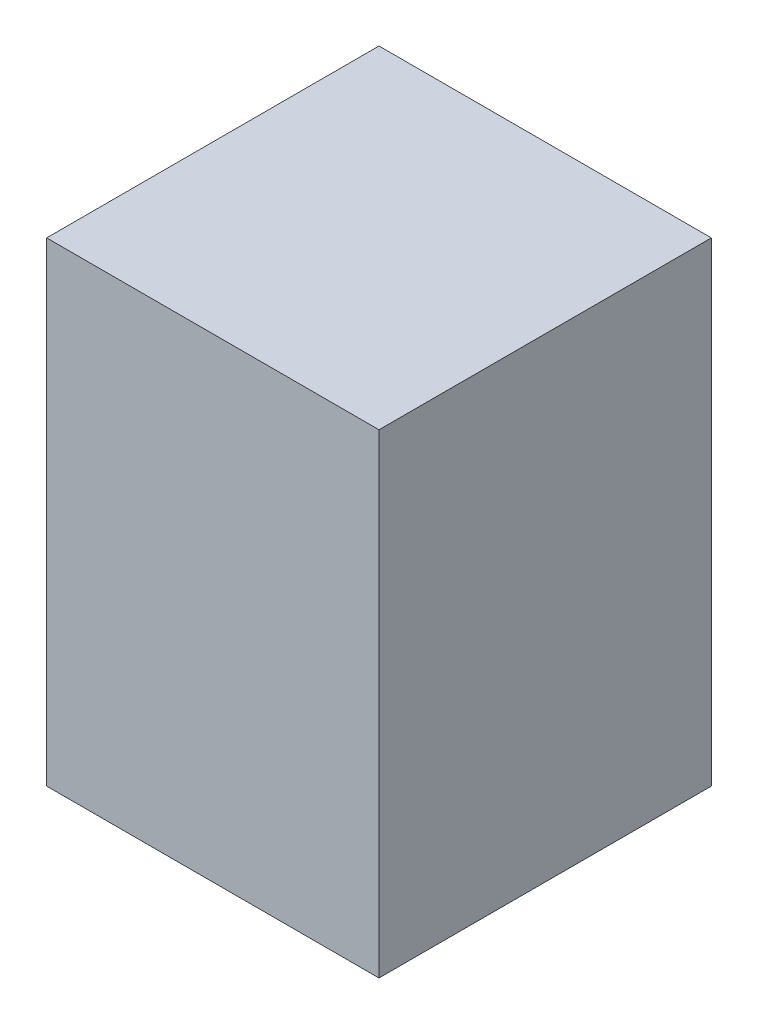
ISO-10303-21;
HEADER;
FILE_DESCRIPTION(('STEP AP214'),'2;1');
FILE_NAME('part.step','',(''),(''),'','','');
FILE_SCHEMA(('AUTOMOTIVE_DESIGN { 1 0 10303 214 1 1 1 1 }'));
ENDSEC;
DATA;
#1=APPLICATION_CONTEXT('core data for automotive mechanical design processes');
#2=APPLICATION_PROTOCOL_DEFINITION('international standard','automotive_design',2000,#1);
#3=PRODUCT_CONTEXT('',#1,'mechanical');
#4=PRODUCT('Part','Part','',(#3));
#5=PRODUCT_RELATED_PRODUCT_CATEGORY('part','',(#4));
#6=PRODUCT_DEFINITION_FORMATION('','',#4);
#7=PRODUCT_DEFINITION_CONTEXT('part definition',#1,'design');
#8=PRODUCT_DEFINITION('design','',#6,#7);
#9=PRODUCT_DEFINITION_SHAPE('','',#8);
#10=(LENGTH_UNIT() NAMED_UNIT(*) SI_UNIT(.MILLI.,.METRE.));
#11=(NAMED_UNIT(*) PLANE_ANGLE_UNIT() SI_UNIT($,.RADIAN.));
#12=(NAMED_UNIT(*) SI_UNIT($,.STERADIAN.) SOLID_ANGLE_UNIT());
#13=UNCERTAINTY_MEASURE_WITH_UNIT(LENGTH_MEASURE(1.E-05),#10,'distance_accuracy_value','');
#14=(GEOMETRIC_REPRESENTATION_CONTEXT(3) GLOBAL_UNCERTAINTY_ASSIGNED_CONTEXT((#13)) GLOBAL_UNIT_ASSIGNED_CONTEXT((#10,
#11,#12)) REPRESENTATION_CONTEXT('',''));
#15=CARTESIAN_POINT('',(0.,0.,0.));
#16=DIRECTION('',(0.,0.,1.));
#17=DIRECTION('',(1.,0.,0.));
#18=AXIS2_PLACEMENT_3D('',#15,#16,#17);
#19=CARTESIAN_POINT('',(-14863.8392857142,9281.24999999997,350.));
#20=DIRECTION('',(1.,0.,0.));
#21=DIRECTION('',(0.,0.,-1.));
#22=AXIS2_PLACEMENT_3D('',#19,#20,#21);
#23=PLANE('',#22);
#24=DIRECTION('',(0.,-1.,0.));
#25=VECTOR('',#24,1.);
#26=CARTESIAN_POINT('',(-14863.8392857142,9281.24999999997,0.));
#27=LINE('',#26,#25);
#28=CARTESIAN_POINT('',(-14863.8392857142,9281.24999999997,0.));
#29=VERTEX_POINT('',#28);
#30=CARTESIAN_POINT('',(-14863.8392857142,8781.24999999997,0.));
#31=VERTEX_POINT('',#30);
#32=EDGE_CURVE('E98',#29,#31,#27,.T.);
#33=ORIENTED_EDGE('',*,*,#32,.T.);
#34=DIRECTION('',(0.,0.,-1.));
#35=VECTOR('',#34,1.);
#36=CARTESIAN_POINT('',(-14863.8392857142,8781.24999999997,350.));
#37=LINE('',#36,#35);
#38=CARTESIAN_POINT('',(-14863.8392857142,8781.24999999997,350.));
#39=VERTEX_POINT('',#38);
#40=EDGE_CURVE('E11',#39,#31,#37,.T.);
#41=ORIENTED_EDGE('',*,*,#40,.F.);
#42=DIRECTION('',(0.,-1.,0.));
#43=VECTOR('',#42,1.);
#44=CARTESIAN_POINT('',(-14863.8392857142,9281.24999999997,350.));
#45=LINE('',#44,#43);
#46=CARTESIAN_POINT('',(-14863.8392857142,9281.24999999997,350.));
#47=VERTEX_POINT('',#46);
#48=EDGE_CURVE('E86',#47,#39,#45,.T.);
#49=ORIENTED_EDGE('',*,*,#48,.F.);
#50=DIRECTION('',(0.,0.,-1.));
#51=VECTOR('',#50,1.);
#52=CARTESIAN_POINT('',(-14863.8392857142,9281.24999999997,350.));
#53=LINE('',#52,#51);
#54=EDGE_CURVE('E94',#47,#29,#53,.T.);
#55=ORIENTED_EDGE('',*,*,#54,.T.);
#56=EDGE_LOOP('',(#33,#41,#49,#55));
#57=FACE_BOUND('',#56,.T.);
#58=ADVANCED_FACE('F35',(#57),#23,.F.);
#59=CARTESIAN_POINT('',(-14863.8392857142,8781.24999999997,350.));
#60=DIRECTION('',(0.,1.,0.));
#61=DIRECTION('',(0.,0.,1.));
#62=AXIS2_PLACEMENT_3D('',#59,#60,#61);
#63=PLANE('',#62);
#64=DIRECTION('',(1.,0.,0.));
#65=VECTOR('',#64,1.);
#66=CARTESIAN_POINT('',(-14863.8392857142,8781.24999999997,0.));
#67=LINE('',#66,#65);
#68=CARTESIAN_POINT('',(-14513.8392857142,8781.24999999997,0.));
#69=VERTEX_POINT('',#68);
#70=EDGE_CURVE('E90',#31,#69,#67,.T.);
#71=ORIENTED_EDGE('',*,*,#70,.T.);
#72=DIRECTION('',(0.,0.,-1.));
#73=VECTOR('',#72,1.);
#74=CARTESIAN_POINT('',(-14513.8392857142,8781.24999999997,350.));
#75=LINE('',#74,#73);
#76=CARTESIAN_POINT('',(-14513.8392857142,8781.24999999997,350.));
#77=VERTEX_POINT('',#76);
#78=EDGE_CURVE('E43',#77,#69,#75,.T.);
#79=ORIENTED_EDGE('',*,*,#78,.F.);
#80=DIRECTION('',(1.,0.,0.));
#81=VECTOR('',#80,1.);
#82=CARTESIAN_POINT('',(-14863.8392857142,8781.24999999997,350.));
#83=LINE('',#82,#81);
#84=EDGE_CURVE('E81',#39,#77,#83,.T.);
#85=ORIENTED_EDGE('',*,*,#84,.F.);
#86=ORIENTED_EDGE('',*,*,#40,.T.);
#87=EDGE_LOOP('',(#71,#79,#85,#86));
#88=FACE_BOUND('',#87,.T.);
#89=ADVANCED_FACE('F89',(#88),#63,.F.);
#90=CARTESIAN_POINT('',(-14513.8392857142,9281.24999999997,350.));
#91=DIRECTION('',(-1.,0.,0.));
#92=DIRECTION('',(0.,0.,1.));
#93=AXIS2_PLACEMENT_3D('',#90,#91,#92);
#94=PLANE('',#93);
#95=DIRECTION('',(0.,1.,0.));
#96=VECTOR('',#95,1.);
#97=CARTESIAN_POINT('',(-14513.8392857142,9281.24999999997,0.));
#98=LINE('',#97,#96);
#99=CARTESIAN_POINT('',(-14513.8392857142,9281.24999999997,0.));
#100=VERTEX_POINT('',#99);
#101=EDGE_CURVE('E68',#69,#100,#98,.T.);
#102=ORIENTED_EDGE('',*,*,#101,.T.);
#103=DIRECTION('',(0.,0.,-1.));
#104=VECTOR('',#103,1.);
#105=CARTESIAN_POINT('',(-14513.8392857142,9281.24999999997,350.));
#106=LINE('',#105,#104);
#107=CARTESIAN_POINT('',(-14513.8392857142,9281.24999999997,350.));
#108=VERTEX_POINT('',#107);
#109=EDGE_CURVE('E91',#108,#100,#106,.T.);
#110=ORIENTED_EDGE('',*,*,#109,.F.);
#111=DIRECTION('',(0.,1.,0.));
#112=VECTOR('',#111,1.);
#113=CARTESIAN_POINT('',(-14513.8392857142,9281.24999999997,350.));
#114=LINE('',#113,#112);
#115=EDGE_CURVE('E84',#77,#108,#114,.T.);
#116=ORIENTED_EDGE('',*,*,#115,.F.);
#117=ORIENTED_EDGE('',*,*,#78,.T.);
#118=EDGE_LOOP('',(#102,#110,#116,#117));
#119=FACE_BOUND('',#118,.T.);
#120=ADVANCED_FACE('F92',(#119),#94,.F.);
#121=CARTESIAN_POINT('',(-14863.8392857142,9281.24999999997,350.));
#122=DIRECTION('',(0.,-1.,0.));
#123=DIRECTION('',(0.,0.,-1.));
#124=AXIS2_PLACEMENT_3D('',#121,#122,#123);
#125=PLANE('',#124);
#126=DIRECTION('',(-1.,0.,0.));
#127=VECTOR('',#126,1.);
#128=CARTESIAN_POINT('',(-14863.8392857142,9281.24999999997,0.));
#129=LINE('',#128,#127);
#130=EDGE_CURVE('E74',#100,#29,#129,.T.);
#131=ORIENTED_EDGE('',*,*,#130,.T.);
#132=ORIENTED_EDGE('',*,*,#54,.F.);
#133=DIRECTION('',(-1.,0.,0.));
#134=VECTOR('',#133,1.);
#135=CARTESIAN_POINT('',(-14863.8392857142,9281.24999999997,350.));
#136=LINE('',#135,#134);
#137=EDGE_CURVE('E51',#108,#47,#136,.T.);
#138=ORIENTED_EDGE('',*,*,#137,.F.);
#139=ORIENTED_EDGE('',*,*,#109,.T.);
#140=EDGE_LOOP('',(#131,#132,#138,#139));
#141=FACE_BOUND('',#140,.T.);
#142=ADVANCED_FACE('F105',(#141),#125,.F.);
#143=CARTESIAN_POINT('',(0.,0.,350.));
#144=DIRECTION('',(0.,0.,1.));
#145=DIRECTION('',(1.,0.,0.));
#146=AXIS2_PLACEMENT_3D('',#143,#144,#145);
#147=PLANE('',#146);
#148=ORIENTED_EDGE('',*,*,#48,.T.);
#149=ORIENTED_EDGE('',*,*,#84,.T.);
#150=ORIENTED_EDGE('',*,*,#115,.T.);
#151=ORIENTED_EDGE('',*,*,#137,.T.);
#152=EDGE_LOOP('',(#148,#149,#150,#151));
#153=FACE_BOUND('',#152,.T.);
#154=ADVANCED_FACE('F82',(#153),#147,.T.);
#155=CARTESIAN_POINT('',(0.,0.,0.));
#156=DIRECTION('',(0.,0.,1.));
#157=DIRECTION('',(1.,0.,0.));
#158=AXIS2_PLACEMENT_3D('',#155,#156,#157);
#159=PLANE('',#158);
#160=ORIENTED_EDGE('',*,*,#32,.F.);
#161=ORIENTED_EDGE('',*,*,#130,.F.);
#162=ORIENTED_EDGE('',*,*,#101,.F.);
#163=ORIENTED_EDGE('',*,*,#70,.F.);
#164=EDGE_LOOP('',(#160,#161,#162,#163));
#165=FACE_BOUND('',#164,.T.);
#166=ADVANCED_FACE('F108',(#165),#159,.F.);
#167=CLOSED_SHELL('',(#58,#89,#120,#142,#154,#166));
#168=MANIFOLD_SOLID_BREP('B2',#167);
#169=ADVANCED_BREP_SHAPE_REPRESENTATION('',(#18,#168),#14);
#170=SHAPE_DEFINITION_REPRESENTATION(#9,#169);
ENDSEC;
END-ISO-10303-21;
